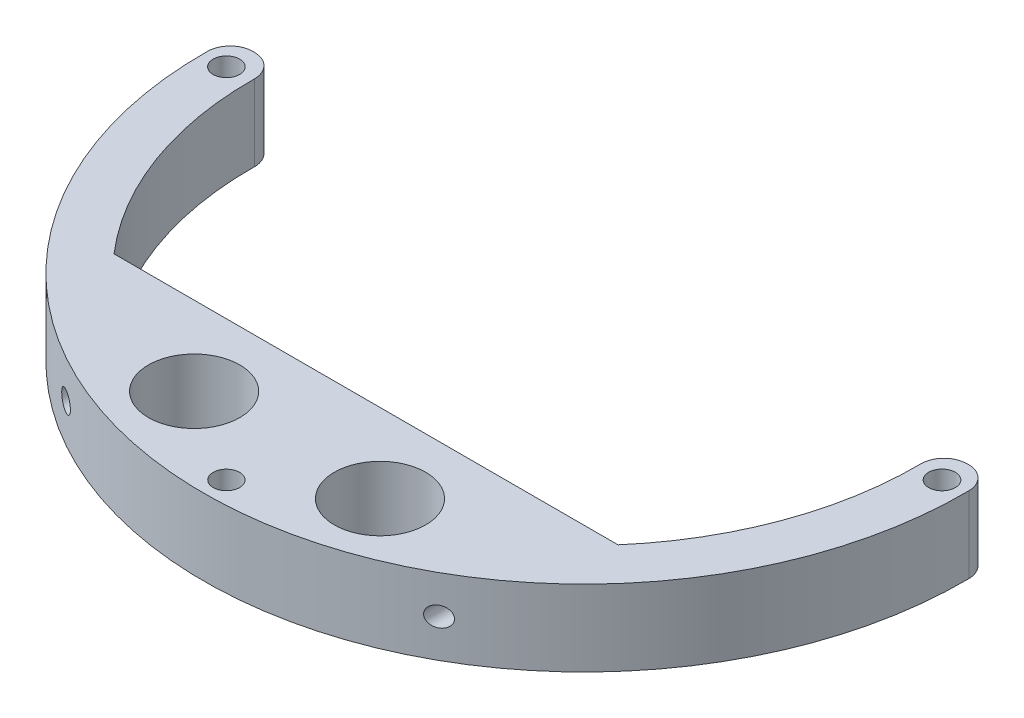
ISO-10303-21;
HEADER;
FILE_DESCRIPTION(('STEP AP214'),'2;1');
FILE_NAME('part.step','',(''),(''),'','','');
FILE_SCHEMA(('AUTOMOTIVE_DESIGN { 1 0 10303 214 1 1 1 1 }'));
ENDSEC;
DATA;
#1=APPLICATION_CONTEXT('core data for automotive mechanical design processes');
#2=APPLICATION_PROTOCOL_DEFINITION('international standard','automotive_design',2000,#1);
#3=PRODUCT_CONTEXT('',#1,'mechanical');
#4=PRODUCT('Part','Part','',(#3));
#5=PRODUCT_RELATED_PRODUCT_CATEGORY('part','',(#4));
#6=PRODUCT_DEFINITION_FORMATION('','',#4);
#7=PRODUCT_DEFINITION_CONTEXT('part definition',#1,'design');
#8=PRODUCT_DEFINITION('design','',#6,#7);
#9=PRODUCT_DEFINITION_SHAPE('','',#8);
#10=(LENGTH_UNIT() NAMED_UNIT(*) SI_UNIT(.MILLI.,.METRE.));
#11=(NAMED_UNIT(*) PLANE_ANGLE_UNIT() SI_UNIT($,.RADIAN.));
#12=(NAMED_UNIT(*) SI_UNIT($,.STERADIAN.) SOLID_ANGLE_UNIT());
#13=UNCERTAINTY_MEASURE_WITH_UNIT(LENGTH_MEASURE(1.E-05),#10,'distance_accuracy_value','');
#14=(GEOMETRIC_REPRESENTATION_CONTEXT(3) GLOBAL_UNCERTAINTY_ASSIGNED_CONTEXT((#13)) GLOBAL_UNIT_ASSIGNED_CONTEXT((#10,
#11,#12)) REPRESENTATION_CONTEXT('',''));
#15=CARTESIAN_POINT('',(0.,0.,0.));
#16=DIRECTION('',(0.,0.,1.));
#17=DIRECTION('',(1.,0.,0.));
#18=AXIS2_PLACEMENT_3D('',#15,#16,#17);
#19=CARTESIAN_POINT('',(0.,10.,0.));
#20=DIRECTION('',(0.,-1.,0.));
#21=DIRECTION('',(0.,0.,-1.));
#22=AXIS2_PLACEMENT_3D('',#19,#20,#21);
#23=PLANE('',#22);
#24=CARTESIAN_POINT('',(0.,10.,0.));
#25=DIRECTION('',(0.,1.,0.));
#26=DIRECTION('',(0.,0.,1.));
#27=AXIS2_PLACEMENT_3D('',#24,#25,#26);
#28=CIRCLE('',#27,49.9999999999988);
#29=CARTESIAN_POINT('',(-49.9972274086437,10.,-0.526546719910579));
#30=VERTEX_POINT('',#29);
#31=CARTESIAN_POINT('',(49.9972274086437,10.,-0.526546719910586));
#32=VERTEX_POINT('',#31);
#33=EDGE_CURVE('E233',#30,#32,#28,.T.);
#34=ORIENTED_EDGE('',*,*,#33,.T.);
#35=CARTESIAN_POINT('',(46.997393764125,10.,-0.49495391671595));
#36=DIRECTION('',(0.,-1.,0.));
#37=DIRECTION('',(0.,0.,-1.));
#38=AXIS2_PLACEMENT_3D('',#35,#36,#37);
#39=CIRCLE('',#38,3.);
#40=CARTESIAN_POINT('',(46.7440831125681,10.,-3.48424040579789));
#41=VERTEX_POINT('',#40);
#42=EDGE_CURVE('E203',#32,#41,#39,.F.);
#43=ORIENTED_EDGE('',*,*,#42,.T.);
#44=DIRECTION('',(-0.996428829693982,0.,0.0844368838522697));
#45=VECTOR('',#44,1.);
#46=CARTESIAN_POINT('',(49.859310291825,10.,-3.74822320885381));
#47=LINE('',#46,#45);
#48=CARTESIAN_POINT('',(46.5274746022037,10.,-3.46588510827336));
#49=VERTEX_POINT('',#48);
#50=EDGE_CURVE('E126',#41,#49,#47,.T.);
#51=ORIENTED_EDGE('',*,*,#50,.T.);
#52=CARTESIAN_POINT('',(46.7807852537605,10.,-0.476598619191415));
#53=DIRECTION('',(0.,-1.,0.));
#54=DIRECTION('',(0.,0.,-1.));
#55=AXIS2_PLACEMENT_3D('',#52,#53,#54);
#56=CIRCLE('',#55,3.);
#57=CARTESIAN_POINT('',(43.7809409320307,10.,-0.446036463088858));
#58=VERTEX_POINT('',#57);
#59=EDGE_CURVE('E54',#49,#58,#56,.F.);
#60=ORIENTED_EDGE('',*,*,#59,.T.);
#61=CARTESIAN_POINT('',(0.,10.,0.));
#62=DIRECTION('',(0.,-1.,0.));
#63=DIRECTION('',(0.,0.,1.));
#64=AXIS2_PLACEMENT_3D('',#61,#62,#63);
#65=CIRCLE('',#64,43.7832129636504);
#66=CARTESIAN_POINT('',(33.0995490719198,10.,28.6598951263946));
#67=VERTEX_POINT('',#66);
#68=EDGE_CURVE('E114',#58,#67,#65,.T.);
#69=ORIENTED_EDGE('',*,*,#68,.T.);
#70=DIRECTION('',(-1.,0.,0.));
#71=VECTOR('',#70,1.);
#72=CARTESIAN_POINT('',(-33.0995490719198,10.,28.6598951263946));
#73=LINE('',#72,#71);
#74=CARTESIAN_POINT('',(-33.0995490719198,10.,28.6598951263946));
#75=VERTEX_POINT('',#74);
#76=EDGE_CURVE('E120',#67,#75,#73,.T.);
#77=ORIENTED_EDGE('',*,*,#76,.T.);
#78=CARTESIAN_POINT('',(0.,10.,0.));
#79=DIRECTION('',(0.,-1.,0.));
#80=DIRECTION('',(0.,0.,-1.));
#81=AXIS2_PLACEMENT_3D('',#78,#79,#80);
#82=CIRCLE('',#81,43.7832129636504);
#83=CARTESIAN_POINT('',(-43.7809409320307,10.,-0.446036463088853));
#84=VERTEX_POINT('',#83);
#85=EDGE_CURVE('E168',#75,#84,#82,.T.);
#86=ORIENTED_EDGE('',*,*,#85,.T.);
#87=CARTESIAN_POINT('',(-46.7807852537605,10.,-0.476598619191409));
#88=DIRECTION('',(0.,-1.,0.));
#89=DIRECTION('',(0.,0.,-1.));
#90=AXIS2_PLACEMENT_3D('',#87,#88,#89);
#91=CIRCLE('',#90,3.);
#92=CARTESIAN_POINT('',(-46.5274746022037,10.,-3.46588510827335));
#93=VERTEX_POINT('',#92);
#94=EDGE_CURVE('E195',#84,#93,#91,.F.);
#95=ORIENTED_EDGE('',*,*,#94,.T.);
#96=DIRECTION('',(-0.996428829693982,0.,-0.0844368838522676));
#97=VECTOR('',#96,1.);
#98=CARTESIAN_POINT('',(-49.859310291825,10.,-3.7482232088538));
#99=LINE('',#98,#97);
#100=CARTESIAN_POINT('',(-46.7440831125681,10.,-3.48424040579789));
#101=VERTEX_POINT('',#100);
#102=EDGE_CURVE('E216',#93,#101,#99,.T.);
#103=ORIENTED_EDGE('',*,*,#102,.T.);
#104=CARTESIAN_POINT('',(-46.997393764125,10.,-0.494953916715943));
#105=DIRECTION('',(0.,-1.,0.));
#106=DIRECTION('',(0.,0.,-1.));
#107=AXIS2_PLACEMENT_3D('',#104,#105,#106);
#108=CIRCLE('',#107,3.);
#109=EDGE_CURVE('E198',#101,#30,#108,.F.);
#110=ORIENTED_EDGE('',*,*,#109,.T.);
#111=EDGE_LOOP('',(#34,#43,#51,#60,#69,#77,#86,#95,#103,#110));
#112=FACE_BOUND('',#111,.T.);
#113=CARTESIAN_POINT('',(-47.,10.,0.));
#114=DIRECTION('',(0.,1.,0.));
#115=DIRECTION('',(0.,0.,1.));
#116=AXIS2_PLACEMENT_3D('',#113,#114,#115);
#117=CIRCLE('',#116,1.75);
#118=CARTESIAN_POINT('',(-47.,10.,1.75));
#119=VERTEX_POINT('',#118);
#120=EDGE_CURVE('E153',#119,#119,#117,.T.);
#121=ORIENTED_EDGE('',*,*,#120,.F.);
#122=EDGE_LOOP('',(#121));
#123=FACE_BOUND('',#122,.T.);
#124=CARTESIAN_POINT('',(0.,10.,47.));
#125=DIRECTION('',(0.,1.,0.));
#126=DIRECTION('',(0.,0.,-1.));
#127=AXIS2_PLACEMENT_3D('',#124,#125,#126);
#128=CIRCLE('',#127,1.7353023937338);
#129=CARTESIAN_POINT('',(0.,10.,45.2646976062662));
#130=VERTEX_POINT('',#129);
#131=EDGE_CURVE('E247',#130,#130,#128,.T.);
#132=ORIENTED_EDGE('',*,*,#131,.F.);
#133=EDGE_LOOP('',(#132));
#134=FACE_BOUND('',#133,.T.);
#135=CARTESIAN_POINT('',(12.2081171528877,10.,39.0309929674964));
#136=DIRECTION('',(0.,1.,0.));
#137=DIRECTION('',(0.,0.,-1.));
#138=AXIS2_PLACEMENT_3D('',#135,#136,#137);
#139=CIRCLE('',#138,6.);
#140=CARTESIAN_POINT('',(12.2081171528877,10.,33.0309929674964));
#141=VERTEX_POINT('',#140);
#142=EDGE_CURVE('E255',#141,#141,#139,.T.);
#143=ORIENTED_EDGE('',*,*,#142,.F.);
#144=EDGE_LOOP('',(#143));
#145=FACE_BOUND('',#144,.T.);
#146=CARTESIAN_POINT('',(-12.2081171528872,10.,39.030992967497));
#147=DIRECTION('',(0.,1.,0.));
#148=DIRECTION('',(0.,0.,1.));
#149=AXIS2_PLACEMENT_3D('',#146,#147,#148);
#150=CIRCLE('',#149,6.);
#151=CARTESIAN_POINT('',(-12.2081171528872,10.,45.030992967497));
#152=VERTEX_POINT('',#151);
#153=EDGE_CURVE('E263',#152,#152,#150,.T.);
#154=ORIENTED_EDGE('',*,*,#153,.F.);
#155=EDGE_LOOP('',(#154));
#156=FACE_BOUND('',#155,.T.);
#157=CARTESIAN_POINT('',(47.,10.,0.));
#158=DIRECTION('',(0.,1.,0.));
#159=DIRECTION('',(0.,0.,-1.));
#160=AXIS2_PLACEMENT_3D('',#157,#158,#159);
#161=CIRCLE('',#160,1.750000000002);
#162=CARTESIAN_POINT('',(47.,10.,-1.75000000000202));
#163=VERTEX_POINT('',#162);
#164=EDGE_CURVE('E271',#163,#163,#161,.T.);
#165=ORIENTED_EDGE('',*,*,#164,.F.);
#166=EDGE_LOOP('',(#165));
#167=FACE_BOUND('',#166,.T.);
#168=ADVANCED_FACE('F38',(#112,#123,#134,#145,#156,#167),#23,.F.);
#169=CARTESIAN_POINT('',(0.,0.,0.));
#170=DIRECTION('',(0.,-1.,0.));
#171=DIRECTION('',(0.,0.,-1.));
#172=AXIS2_PLACEMENT_3D('',#169,#170,#171);
#173=PLANE('',#172);
#174=CARTESIAN_POINT('',(-12.2081171528872,0.,39.030992967497));
#175=DIRECTION('',(0.,1.,0.));
#176=DIRECTION('',(0.,0.,1.));
#177=AXIS2_PLACEMENT_3D('',#174,#175,#176);
#178=CIRCLE('',#177,6.);
#179=CARTESIAN_POINT('',(-12.2081171528872,0.,45.030992967497));
#180=VERTEX_POINT('',#179);
#181=EDGE_CURVE('E267',#180,#180,#178,.T.);
#182=ORIENTED_EDGE('',*,*,#181,.T.);
#183=EDGE_LOOP('',(#182));
#184=FACE_BOUND('',#183,.T.);
#185=CARTESIAN_POINT('',(0.,0.,47.));
#186=DIRECTION('',(0.,1.,0.));
#187=DIRECTION('',(0.,0.,-1.));
#188=AXIS2_PLACEMENT_3D('',#185,#186,#187);
#189=CIRCLE('',#188,1.7353023937338);
#190=CARTESIAN_POINT('',(0.,0.,45.2646976062662));
#191=VERTEX_POINT('',#190);
#192=EDGE_CURVE('E251',#191,#191,#189,.T.);
#193=ORIENTED_EDGE('',*,*,#192,.T.);
#194=EDGE_LOOP('',(#193));
#195=FACE_BOUND('',#194,.T.);
#196=DIRECTION('',(-0.996428829693982,0.,0.0844368838522697));
#197=VECTOR('',#196,1.);
#198=CARTESIAN_POINT('',(49.859310291825,0.,-3.74822320885381));
#199=LINE('',#198,#197);
#200=CARTESIAN_POINT('',(46.7440831125681,0.,-3.48424040579789));
#201=VERTEX_POINT('',#200);
#202=CARTESIAN_POINT('',(46.5274746022037,0.,-3.46588510827336));
#203=VERTEX_POINT('',#202);
#204=EDGE_CURVE('E160',#201,#203,#199,.T.);
#205=ORIENTED_EDGE('',*,*,#204,.F.);
#206=CARTESIAN_POINT('',(46.997393764125,0.,-0.49495391671595));
#207=DIRECTION('',(0.,-1.,0.));
#208=DIRECTION('',(0.,0.,-1.));
#209=AXIS2_PLACEMENT_3D('',#206,#207,#208);
#210=CIRCLE('',#209,3.);
#211=CARTESIAN_POINT('',(49.9972274086437,0.,-0.526546719910586));
#212=VERTEX_POINT('',#211);
#213=EDGE_CURVE('E185',#201,#212,#210,.T.);
#214=ORIENTED_EDGE('',*,*,#213,.T.);
#215=CARTESIAN_POINT('',(0.,0.,0.));
#216=DIRECTION('',(0.,1.,0.));
#217=DIRECTION('',(0.,0.,1.));
#218=AXIS2_PLACEMENT_3D('',#215,#216,#217);
#219=CIRCLE('',#218,49.9999999999988);
#220=CARTESIAN_POINT('',(-49.9972274086437,0.,-0.526546719910579));
#221=VERTEX_POINT('',#220);
#222=EDGE_CURVE('E156',#221,#212,#219,.T.);
#223=ORIENTED_EDGE('',*,*,#222,.F.);
#224=CARTESIAN_POINT('',(-46.997393764125,0.,-0.494953916715943));
#225=DIRECTION('',(0.,-1.,0.));
#226=DIRECTION('',(0.,0.,-1.));
#227=AXIS2_PLACEMENT_3D('',#224,#225,#226);
#228=CIRCLE('',#227,3.);
#229=CARTESIAN_POINT('',(-46.7440831125681,0.,-3.48424040579789));
#230=VERTEX_POINT('',#229);
#231=EDGE_CURVE('E179',#221,#230,#228,.T.);
#232=ORIENTED_EDGE('',*,*,#231,.T.);
#233=DIRECTION('',(-0.996428829693982,0.,-0.0844368838522676));
#234=VECTOR('',#233,1.);
#235=CARTESIAN_POINT('',(-49.859310291825,0.,-3.7482232088538));
#236=LINE('',#235,#234);
#237=CARTESIAN_POINT('',(-46.5274746022037,0.,-3.46588510827335));
#238=VERTEX_POINT('',#237);
#239=EDGE_CURVE('E152',#238,#230,#236,.T.);
#240=ORIENTED_EDGE('',*,*,#239,.F.);
#241=CARTESIAN_POINT('',(-46.7807852537605,0.,-0.476598619191409));
#242=DIRECTION('',(0.,-1.,0.));
#243=DIRECTION('',(0.,0.,-1.));
#244=AXIS2_PLACEMENT_3D('',#241,#242,#243);
#245=CIRCLE('',#244,3.);
#246=CARTESIAN_POINT('',(-43.7809409320307,0.,-0.446036463088853));
#247=VERTEX_POINT('',#246);
#248=EDGE_CURVE('E176',#238,#247,#245,.T.);
#249=ORIENTED_EDGE('',*,*,#248,.T.);
#250=CARTESIAN_POINT('',(0.,0.,0.));
#251=DIRECTION('',(0.,-1.,0.));
#252=DIRECTION('',(0.,0.,-1.));
#253=AXIS2_PLACEMENT_3D('',#250,#251,#252);
#254=CIRCLE('',#253,43.7832129636504);
#255=CARTESIAN_POINT('',(-33.0995490719198,0.,28.6598951263946));
#256=VERTEX_POINT('',#255);
#257=EDGE_CURVE('E148',#256,#247,#254,.T.);
#258=ORIENTED_EDGE('',*,*,#257,.F.);
#259=DIRECTION('',(-1.,0.,0.));
#260=VECTOR('',#259,1.);
#261=CARTESIAN_POINT('',(-33.0995490719198,0.,28.6598951263946));
#262=LINE('',#261,#260);
#263=CARTESIAN_POINT('',(33.0995490719198,0.,28.6598951263946));
#264=VERTEX_POINT('',#263);
#265=EDGE_CURVE('E166',#264,#256,#262,.T.);
#266=ORIENTED_EDGE('',*,*,#265,.F.);
#267=CARTESIAN_POINT('',(0.,0.,0.));
#268=DIRECTION('',(0.,-1.,0.));
#269=DIRECTION('',(0.,0.,1.));
#270=AXIS2_PLACEMENT_3D('',#267,#268,#269);
#271=CIRCLE('',#270,43.7832129636504);
#272=CARTESIAN_POINT('',(43.7809409320307,0.,-0.446036463088858));
#273=VERTEX_POINT('',#272);
#274=EDGE_CURVE('E132',#273,#264,#271,.T.);
#275=ORIENTED_EDGE('',*,*,#274,.F.);
#276=CARTESIAN_POINT('',(46.7807852537605,0.,-0.476598619191415));
#277=DIRECTION('',(0.,-1.,0.));
#278=DIRECTION('',(0.,0.,-1.));
#279=AXIS2_PLACEMENT_3D('',#276,#277,#278);
#280=CIRCLE('',#279,3.);
#281=EDGE_CURVE('E182',#273,#203,#280,.T.);
#282=ORIENTED_EDGE('',*,*,#281,.T.);
#283=EDGE_LOOP('',(#205,#214,#223,#232,#240,#249,#258,#266,#275,#282));
#284=FACE_BOUND('',#283,.T.);
#285=CARTESIAN_POINT('',(-47.,0.,0.));
#286=DIRECTION('',(0.,1.,0.));
#287=DIRECTION('',(0.,0.,1.));
#288=AXIS2_PLACEMENT_3D('',#285,#286,#287);
#289=CIRCLE('',#288,1.75);
#290=CARTESIAN_POINT('',(-47.,0.,1.75));
#291=VERTEX_POINT('',#290);
#292=EDGE_CURVE('E243',#291,#291,#289,.T.);
#293=ORIENTED_EDGE('',*,*,#292,.T.);
#294=EDGE_LOOP('',(#293));
#295=FACE_BOUND('',#294,.T.);
#296=CARTESIAN_POINT('',(12.2081171528877,0.,39.0309929674964));
#297=DIRECTION('',(0.,1.,0.));
#298=DIRECTION('',(0.,0.,-1.));
#299=AXIS2_PLACEMENT_3D('',#296,#297,#298);
#300=CIRCLE('',#299,6.);
#301=CARTESIAN_POINT('',(12.2081171528877,0.,33.0309929674964));
#302=VERTEX_POINT('',#301);
#303=EDGE_CURVE('E259',#302,#302,#300,.T.);
#304=ORIENTED_EDGE('',*,*,#303,.T.);
#305=EDGE_LOOP('',(#304));
#306=FACE_BOUND('',#305,.T.);
#307=CARTESIAN_POINT('',(47.,0.,0.));
#308=DIRECTION('',(0.,1.,0.));
#309=DIRECTION('',(0.,0.,-1.));
#310=AXIS2_PLACEMENT_3D('',#307,#308,#309);
#311=CIRCLE('',#310,1.750000000002);
#312=CARTESIAN_POINT('',(47.,0.,-1.75000000000202));
#313=VERTEX_POINT('',#312);
#314=EDGE_CURVE('E275',#313,#313,#311,.T.);
#315=ORIENTED_EDGE('',*,*,#314,.T.);
#316=EDGE_LOOP('',(#315));
#317=FACE_BOUND('',#316,.T.);
#318=ADVANCED_FACE('F221',(#184,#195,#284,#295,#306,#317),#173,.T.);
#319=CARTESIAN_POINT('',(0.,10.,0.));
#320=DIRECTION('',(0.,-1.,0.));
#321=DIRECTION('',(0.,0.,-1.));
#322=AXIS2_PLACEMENT_3D('',#319,#320,#321);
#323=CYLINDRICAL_SURFACE('',#322,43.7832129636504);
#324=ORIENTED_EDGE('',*,*,#257,.T.);
#325=DIRECTION('',(0.,-1.,0.));
#326=VECTOR('',#325,1.);
#327=CARTESIAN_POINT('',(-43.7809409320307,10.,-0.446036463088853));
#328=LINE('',#327,#326);
#329=EDGE_CURVE('E11',#247,#84,#328,.F.);
#330=ORIENTED_EDGE('',*,*,#329,.T.);
#331=ORIENTED_EDGE('',*,*,#85,.F.);
#332=DIRECTION('',(0.,-1.,0.));
#333=VECTOR('',#332,1.);
#334=CARTESIAN_POINT('',(-33.0995490719198,10.,28.6598951263946));
#335=LINE('',#334,#333);
#336=EDGE_CURVE('E137',#75,#256,#335,.T.);
#337=ORIENTED_EDGE('',*,*,#336,.T.);
#338=EDGE_LOOP('',(#324,#330,#331,#337));
#339=FACE_BOUND('',#338,.T.);
#340=ADVANCED_FACE('F334',(#339),#323,.F.);
#341=CARTESIAN_POINT('',(-49.859310291825,10.,-3.7482232088538));
#342=DIRECTION('',(-0.0844368838522676,0.,0.996428829693982));
#343=DIRECTION('',(0.996428829693982,0.,0.0844368838522676));
#344=AXIS2_PLACEMENT_3D('',#341,#342,#343);
#345=PLANE('',#344);
#346=ORIENTED_EDGE('',*,*,#239,.T.);
#347=DIRECTION('',(0.,-1.,0.));
#348=VECTOR('',#347,1.);
#349=CARTESIAN_POINT('',(-46.7440831125681,10.,-3.48424040579789));
#350=LINE('',#349,#348);
#351=EDGE_CURVE('E47',#230,#101,#350,.F.);
#352=ORIENTED_EDGE('',*,*,#351,.T.);
#353=ORIENTED_EDGE('',*,*,#102,.F.);
#354=DIRECTION('',(0.,-1.,0.));
#355=VECTOR('',#354,1.);
#356=CARTESIAN_POINT('',(-46.5274746022037,10.,-3.46588510827335));
#357=LINE('',#356,#355);
#358=EDGE_CURVE('E209',#93,#238,#357,.T.);
#359=ORIENTED_EDGE('',*,*,#358,.T.);
#360=EDGE_LOOP('',(#346,#352,#353,#359));
#361=FACE_BOUND('',#360,.T.);
#362=ADVANCED_FACE('F215',(#361),#345,.F.);
#363=CARTESIAN_POINT('',(0.,10.,0.));
#364=DIRECTION('',(0.,-1.,0.));
#365=DIRECTION('',(0.,0.,-1.));
#366=AXIS2_PLACEMENT_3D('',#363,#364,#365);
#367=CYLINDRICAL_SURFACE('',#366,49.9999999999988);
#368=CARTESIAN_POINT('',(-25.7999934874738,5.02526316537584,42.8294330577255));
#369=CARTESIAN_POINT('',(-25.7999893380254,5.09076688627117,42.8294357089718));
#370=CARTESIAN_POINT('',(-25.7950118462503,5.15633897311552,42.8324351679322));
#371=CARTESIAN_POINT('',(-25.7753547714024,5.28552932204338,42.8442669573359));
#372=CARTESIAN_POINT('',(-25.7606591447959,5.34914417089712,42.85310893309));
#373=CARTESIAN_POINT('',(-25.7223921638513,5.47235010631283,42.876089290113));
#374=CARTESIAN_POINT('',(-25.698853699102,5.53195514986238,42.8902080442196));
#375=CARTESIAN_POINT('',(-25.6439603924868,5.646028985418,42.9230510778811));
#376=CARTESIAN_POINT('',(-25.6126060679422,5.70049811703454,42.9417750526214));
#377=CARTESIAN_POINT('',(-25.5412633748741,5.80632588590958,42.9842492109798));
#378=CARTESIAN_POINT('',(-25.5008837974589,5.85732852201816,43.0082255906994));
#379=CARTESIAN_POINT('',(-25.4140524555835,5.95188176744041,43.0595922412296));
#380=CARTESIAN_POINT('',(-25.3675980842668,5.99542915887716,43.0869839774248));
#381=CARTESIAN_POINT('',(-25.2631877868906,6.08008316717226,43.1482963865113));
#382=CARTESIAN_POINT('',(-25.2045274748107,6.1200449080782,43.1825978680917));
#383=CARTESIAN_POINT('',(-25.0826104780436,6.18951713880106,43.2535274298388));
#384=CARTESIAN_POINT('',(-25.0193512475708,6.21902178605812,43.2901567972008));
#385=CARTESIAN_POINT('',(-24.8812369707137,6.27056128964972,43.3697034997026));
#386=CARTESIAN_POINT('',(-24.8059442983703,6.29112411074977,43.4128187348702));
#387=CARTESIAN_POINT('',(-24.653256531982,6.31852758613374,43.4997088617462));
#388=CARTESIAN_POINT('',(-24.57586048014,6.32536187915648,43.5434840497904));
#389=CARTESIAN_POINT('',(-24.4150772577193,6.3251549584865,43.6338528040294));
#390=CARTESIAN_POINT('',(-24.3316708994811,6.3170486224389,43.6804149933069));
#391=CARTESIAN_POINT('',(-24.1669862618882,6.28468691530931,43.7717448058892));
#392=CARTESIAN_POINT('',(-24.0857083194895,6.26042900309504,43.8165121456346));
#393=CARTESIAN_POINT('',(-23.9292284643574,6.1962723002094,43.9021623064696));
#394=CARTESIAN_POINT('',(-23.8539503052521,6.15662920471361,43.9430957044735));
#395=CARTESIAN_POINT('',(-23.7110168074873,6.06201105554023,44.0203848062878));
#396=CARTESIAN_POINT('',(-23.6433567821552,6.00704550138696,44.0567433261975));
#397=CARTESIAN_POINT('',(-23.5251305020064,5.88893025254006,44.1199761170397));
#398=CARTESIAN_POINT('',(-23.4735358156326,5.82712582844948,44.1474325365071));
#399=CARTESIAN_POINT('',(-23.3818551932939,5.69333525780574,44.196058074893));
#400=CARTESIAN_POINT('',(-23.3417565963046,5.62136044372685,44.2172341114988));
#401=CARTESIAN_POINT('',(-23.2798033833195,5.47949857823006,44.249879362681));
#402=CARTESIAN_POINT('',(-23.2562540687494,5.41055786965727,44.2622529369388));
#403=CARTESIAN_POINT('',(-23.2209544988601,5.26892722297918,44.2807822708067));
#404=CARTESIAN_POINT('',(-23.2091957836066,5.19624001247578,44.2869424886132));
#405=CARTESIAN_POINT('',(-23.1986713054985,5.05667722482253,44.292456208518));
#406=CARTESIAN_POINT('',(-23.198774746683,4.98990747333265,44.2924021083751));
#407=CARTESIAN_POINT('',(-23.2091665679811,4.85739657461975,44.2869576937641));
#408=CARTESIAN_POINT('',(-23.2194528936705,4.79165522263206,44.2815684556743));
#409=CARTESIAN_POINT('',(-23.2493672207346,4.66456779135892,44.2658694382703));
#410=CARTESIAN_POINT('',(-23.2687776765783,4.60315578808121,44.2556742318165));
#411=CARTESIAN_POINT('',(-23.3160169684815,4.48464212288271,44.2308044408234));
#412=CARTESIAN_POINT('',(-23.3438470076815,4.42754107844689,44.2161292160963));
#413=CARTESIAN_POINT('',(-23.4083952883666,4.31621322128371,44.1819920465078));
#414=CARTESIAN_POINT('',(-23.4454787314269,4.2622595636725,44.1623326899729));
#415=CARTESIAN_POINT('',(-23.5263961837438,4.16137971623955,44.1192790247764));
#416=CARTESIAN_POINT('',(-23.5702325533256,4.11445599492057,44.0958834100892));
#417=CARTESIAN_POINT('',(-23.6679030340333,4.0240247386043,44.0435434754368));
#418=CARTESIAN_POINT('',(-23.7222964234368,3.98130722607795,44.0142797275907));
#419=CARTESIAN_POINT('',(-23.8359512690684,3.90556759700377,43.9528338798385));
#420=CARTESIAN_POINT('',(-23.8952149135154,3.87254986941253,43.9206504674367));
#421=CARTESIAN_POINT('',(-24.0243437497033,3.81307953347361,43.8501645147238));
#422=CARTESIAN_POINT('',(-24.0946327248179,3.78786980798069,43.8115889189382));
#423=CARTESIAN_POINT('',(-24.2375477402811,3.74988226487058,43.7326874873431));
#424=CARTESIAN_POINT('',(-24.3101748906185,3.73711044448395,43.6923608169907));
#425=CARTESIAN_POINT('',(-24.4634682956506,3.72327633573388,43.6067331019206));
#426=CARTESIAN_POINT('',(-24.544204742498,3.72352890592662,43.5613414424675));
#427=CARTESIAN_POINT('',(-24.7043670413865,3.73890824627399,43.4707111430899));
#428=CARTESIAN_POINT('',(-24.7837923483113,3.75404105214154,43.4254725727331));
#429=CARTESIAN_POINT('',(-24.9423336936206,3.79994118337128,43.3346127262005));
#430=CARTESIAN_POINT('',(-25.0213103907263,3.83130943895761,43.2890484701012));
#431=CARTESIAN_POINT('',(-25.1730068326495,3.90976343734359,43.201011759261));
#432=CARTESIAN_POINT('',(-25.245726898068,3.95684837418795,43.1585391461159));
#433=CARTESIAN_POINT('',(-25.3781864058744,4.06318873122481,43.0807756685537));
#434=CARTESIAN_POINT('',(-25.4384217620757,4.12162547731625,43.0452173021624));
#435=CARTESIAN_POINT('',(-25.5477823318029,4.25112208440035,42.9804009291829));
#436=CARTESIAN_POINT('',(-25.5969173474669,4.32217070869038,42.9511373650808));
#437=CARTESIAN_POINT('',(-25.6751397900651,4.46429909788253,42.9044168997723));
#438=CARTESIAN_POINT('',(-25.7060593914235,4.53401746543506,42.8858872070955));
#439=CARTESIAN_POINT('',(-25.7553856032479,4.67911728935262,42.856282577099));
#440=CARTESIAN_POINT('',(-25.773831778517,4.75447998935087,42.8451840697089));
#441=CARTESIAN_POINT('',(-25.7902590197372,4.86317043332086,42.835295766634));
#442=CARTESIAN_POINT('',(-25.7939026119482,4.89543513535774,42.8331016346402));
#443=CARTESIAN_POINT('',(-25.7987708837705,4.96021532462798,42.8301696172746));
#444=CARTESIAN_POINT('',(-25.7999955482928,4.99273081342445,42.8294317409868));
#445=CARTESIAN_POINT('',(-25.7999934874738,5.02526316537584,42.8294330577255));
#446=B_SPLINE_CURVE_WITH_KNOTS('',3,(#368,#369,#370,#371,#372,#373,#374,#375,#376,#377,#378,
#379,#380,#381,#382,#383,#384,#385,#386,#387,#388,#389,#390,#391,#392,#393,#394,#395,#396,#397,
#398,#399,#400,#401,#402,#403,#404,#405,#406,#407,#408,#409,#410,#411,#412,#413,#414,#415,#416,
#417,#418,#419,#420,#421,#422,#423,#424,#425,#426,#427,#428,#429,#430,#431,#432,#433,#434,#435,
#436,#437,#438,#439,#440,#441,#442,#443,#444,#445),.UNSPECIFIED.,.T.,.F.,(4,2,2,2,2,2,2,2,2,2,2,
2,2,2,2,2,2,2,2,2,2,2,2,2,2,2,2,2,2,2,2,2,2,2,2,2,2,2,4),(0.,0.196379172232976,
0.393083356176662,0.58906305791891,0.785029791466927,0.99220302331417,1.19946545227697,
1.43502389380698,1.67071373922263,1.93707958352731,2.20356882286796,2.4897945600332,
2.77606533982274,3.05776919571047,3.33929878950248,3.59301127041075,3.84644324642633,
4.06690807327927,4.28721459982653,4.48653900055042,4.68582319523593,4.88057979778099,
5.07536424378576,5.27958273963281,5.48387277784752,5.70825733254752,5.932743260894,
6.18385062685862,6.43507901032838,6.7117150454692,6.98846333587102,7.27627699024038,
7.5640758877216,7.83593208160242,8.10754726670357,8.34162359008862,8.57495391317178,
8.67248480772852,8.77001631066736),.UNSPECIFIED.);
#447=CARTESIAN_POINT('',(-25.7999934874738,5.02526316537584,42.8294330577255));
#448=VERTEX_POINT('',#447);
#449=EDGE_CURVE('E279',#448,#448,#446,.T.);
#450=ORIENTED_EDGE('',*,*,#449,.T.);
#451=EDGE_LOOP('',(#450));
#452=FACE_BOUND('',#451,.T.);
#453=CARTESIAN_POINT('',(23.2,5.,44.2917599559994));
#454=CARTESIAN_POINT('',(23.2000030489971,5.06685354656852,44.2917584818056));
#455=CARTESIAN_POINT('',(23.2051829712927,5.13374378191699,44.289046308623));
#456=CARTESIAN_POINT('',(23.2256607822069,5.26555084000743,44.2783108181499));
#457=CARTESIAN_POINT('',(23.2409680305821,5.33046577905793,44.2702825877103));
#458=CARTESIAN_POINT('',(23.280927912492,5.45629995017281,44.2492813396422));
#459=CARTESIAN_POINT('',(23.3055562009771,5.51722911034593,44.2363212028759));
#460=CARTESIAN_POINT('',(23.3631068302247,5.63379996747237,44.2059531396604));
#461=CARTESIAN_POINT('',(23.3960292452366,5.6894416170854,44.1885451733938));
#462=CARTESIAN_POINT('',(23.470526983978,5.79663555296811,44.1490227687062));
#463=CARTESIAN_POINT('',(23.5124155706778,5.84790595937503,44.1267370027643));
#464=CARTESIAN_POINT('',(23.6024484152433,5.94269790851489,44.0786460052433));
#465=CARTESIAN_POINT('',(23.6505948572505,5.98621673313015,44.0528395447007));
#466=CARTESIAN_POINT('',(23.7572383006169,6.06927653163329,43.9954278548077));
#467=CARTESIAN_POINT('',(23.8162915700959,6.10787752887436,43.9634973196952));
#468=CARTESIAN_POINT('',(23.938651475574,6.17462837171638,43.8969910394702));
#469=CARTESIAN_POINT('',(24.0019601703735,6.20277311491042,43.8624140128308));
#470=CARTESIAN_POINT('',(24.1389139439953,6.25119662981955,43.7872084175698));
#471=CARTESIAN_POINT('',(24.2128979348615,6.27015763078781,43.746346883807));
#472=CARTESIAN_POINT('',(24.3623195684454,6.29490763844501,43.6633107320208));
#473=CARTESIAN_POINT('',(24.4377578320155,6.30069088786571,43.6211355482263));
#474=CARTESIAN_POINT('',(24.5949982121736,6.29911123973436,43.5326876091452));
#475=CARTESIAN_POINT('',(24.676772486661,6.29053922364764,43.4863826377631));
#476=CARTESIAN_POINT('',(24.8377753244537,6.25803695790606,43.3946253851014));
#477=CARTESIAN_POINT('',(24.9170024670461,6.23409828807251,43.3491735853807));
#478=CARTESIAN_POINT('',(25.0718279199448,6.17052565732379,43.2598146234599));
#479=CARTESIAN_POINT('',(25.1473464002001,6.13064311206303,43.2159445348068));
#480=CARTESIAN_POINT('',(25.2905748639535,6.03554766484642,43.1322812638752));
#481=CARTESIAN_POINT('',(25.3582947396926,5.98035449384132,43.0924829240512));
#482=CARTESIAN_POINT('',(25.4687026340874,5.86963894682242,43.0272975713647));
#483=CARTESIAN_POINT('',(25.5135873056335,5.81701763738015,43.0006874199937));
#484=CARTESIAN_POINT('',(25.5951982777618,5.70384506934161,42.9521603291831));
#485=CARTESIAN_POINT('',(25.6319289986,5.64329813566522,42.9302408471652));
#486=CARTESIAN_POINT('',(25.6957393229819,5.51513198585823,42.8920783060998));
#487=CARTESIAN_POINT('',(25.722758962894,5.44747205423954,42.8758705270459));
#488=CARTESIAN_POINT('',(25.7652515056777,5.30738152361488,42.8503493713941));
#489=CARTESIAN_POINT('',(25.7807320340156,5.23495410964193,42.8410314417648));
#490=CARTESIAN_POINT('',(25.798116416388,5.09611433819715,42.8305647543754));
#491=CARTESIAN_POINT('',(25.8013331169994,5.02992329472241,42.8286260875687));
#492=CARTESIAN_POINT('',(25.7976658906057,4.89793683345646,42.8308351613182));
#493=CARTESIAN_POINT('',(25.7907851944859,4.8321412958775,42.8349809550169));
#494=CARTESIAN_POINT('',(25.7678868519757,4.70611527816402,42.8487592639325));
#495=CARTESIAN_POINT('',(25.7523280107464,4.6457696169738,42.8581162347713));
#496=CARTESIAN_POINT('',(25.7131526607298,4.52875775529138,42.8816312529612));
#497=CARTESIAN_POINT('',(25.6895350381565,4.47209206468886,42.8957899639483));
#498=CARTESIAN_POINT('',(25.6337703437374,4.36074800076796,42.9291383897576));
#499=CARTESIAN_POINT('',(25.601240979615,4.30632961185318,42.9485529684471));
#500=CARTESIAN_POINT('',(25.5295268964293,4.20376157809867,42.9912199914904));
#501=CARTESIAN_POINT('',(25.4903394705137,4.15561449699617,43.0144739966641));
#502=CARTESIAN_POINT('',(25.4014642226377,4.06081256754116,43.0670243011038));
#503=CARTESIAN_POINT('',(25.3510808987686,4.01502719252622,43.0967107137588));
#504=CARTESIAN_POINT('',(25.2449727418308,3.93250775726323,43.1589520336947));
#505=CARTESIAN_POINT('',(25.1892451586942,3.89577839217947,43.1915084171118));
#506=CARTESIAN_POINT('',(25.0657687671018,3.82715692820929,43.2632986098039));
#507=CARTESIAN_POINT('',(24.9974254274173,3.79664558331889,43.3028317601326));
#508=CARTESIAN_POINT('',(24.8573344070823,3.7478736834432,43.3834008368342));
#509=CARTESIAN_POINT('',(24.7855849696458,3.72961952557576,43.4244375361572));
#510=CARTESIAN_POINT('',(24.6326578245029,3.70422920048563,43.5113856513547));
#511=CARTESIAN_POINT('',(24.5512824995154,3.69846514779868,43.557355611337));
#512=CARTESIAN_POINT('',(24.3885167777883,3.70223189277303,43.6486994920892));
#513=CARTESIAN_POINT('',(24.307126385475,3.71176794562971,43.6940732026655));
#514=CARTESIAN_POINT('',(24.1444622572204,3.74672666574638,43.7841730278844));
#515=CARTESIAN_POINT('',(24.063249218825,3.7725651900272,43.8288498077899));
#516=CARTESIAN_POINT('',(23.9059523986906,3.84050064700904,43.914843391091));
#517=CARTESIAN_POINT('',(23.8298673579624,3.88259357184209,43.9561610197189));
#518=CARTESIAN_POINT('',(23.6907055845464,3.97933992643604,44.0313106682448));
#519=CARTESIAN_POINT('',(23.627102964842,4.0329884651311,44.0654559144253));
#520=CARTESIAN_POINT('',(23.5100586960701,4.1532217585648,44.1280131779347));
#521=CARTESIAN_POINT('',(23.4566089900456,4.21979617027228,44.1564297424294));
#522=CARTESIAN_POINT('',(23.3687400218688,4.35507080608421,44.2029881423383));
#523=CARTESIAN_POINT('',(23.3327830881552,4.42248462243604,44.2219669653133));
#524=CARTESIAN_POINT('',(23.2729749467522,4.56380658171633,44.2534721017028));
#525=CARTESIAN_POINT('',(23.249098497377,4.63770080160511,44.2660118700863));
#526=CARTESIAN_POINT('',(23.2213954637208,4.76024590708946,44.2805479515497));
#527=CARTESIAN_POINT('',(23.2133928968154,4.80773796813796,44.2847425872791));
#528=CARTESIAN_POINT('',(23.2026943436366,4.90348036432823,44.2903489751795));
#529=CARTESIAN_POINT('',(23.199997798573,4.95173061908323,44.2917610203921));
#530=CARTESIAN_POINT('',(23.2,5.,44.2917599559994));
#531=B_SPLINE_CURVE_WITH_KNOTS('',3,(#453,#454,#455,#456,#457,#458,#459,#460,#461,#462,#463,
#464,#465,#466,#467,#468,#469,#470,#471,#472,#473,#474,#475,#476,#477,#478,#479,#480,#481,#482,
#483,#484,#485,#486,#487,#488,#489,#490,#491,#492,#493,#494,#495,#496,#497,#498,#499,#500,#501,
#502,#503,#504,#505,#506,#507,#508,#509,#510,#511,#512,#513,#514,#515,#516,#517,#518,#519,#520,
#521,#522,#523,#524,#525,#526,#527,#528,#529,#530),.UNSPECIFIED.,.T.,.F.,(4,2,2,2,2,2,2,2,2,2,2,
2,2,2,2,2,2,2,2,2,2,2,2,2,2,2,2,2,2,2,2,2,2,2,2,2,2,2,4),(0.,0.200374237618607,
0.400933921905226,0.600973351805115,0.801014572534812,1.00972854343044,1.21851555710525,
1.44989469528113,1.68138659321313,1.94015780435559,2.19904204918605,2.48084465071136,
2.76280179831669,3.04933804993888,3.33550674140881,3.55691509715283,3.77820313274102,
4.00083500056733,4.22331961437231,4.42118362693387,4.61898434233239,4.80720225553325,
4.99544619244991,5.19356025191061,5.39175504873435,5.6136889422603,5.83573765845907,
6.0886323421733,6.34165891114454,6.62131203508691,6.90106123329728,7.18825213138826,
7.47537226162807,7.74366078971923,8.01173551680522,8.24658107910921,8.4809338933699,
8.62562268903778,8.77029624635768),.UNSPECIFIED.);
#532=CARTESIAN_POINT('',(23.2,5.,44.2917599559994));
#533=VERTEX_POINT('',#532);
#534=EDGE_CURVE('E291',#533,#533,#531,.T.);
#535=ORIENTED_EDGE('',*,*,#534,.T.);
#536=EDGE_LOOP('',(#535));
#537=FACE_BOUND('',#536,.T.);
#538=ORIENTED_EDGE('',*,*,#222,.T.);
#539=DIRECTION('',(0.,-1.,0.));
#540=VECTOR('',#539,1.);
#541=CARTESIAN_POINT('',(49.9972274086437,10.,-0.526546719910586));
#542=LINE('',#541,#540);
#543=EDGE_CURVE('E192',#212,#32,#542,.F.);
#544=ORIENTED_EDGE('',*,*,#543,.T.);
#545=ORIENTED_EDGE('',*,*,#33,.F.);
#546=DIRECTION('',(0.,-1.,0.));
#547=VECTOR('',#546,1.);
#548=CARTESIAN_POINT('',(-49.9972274086437,10.,-0.526546719910579));
#549=LINE('',#548,#547);
#550=EDGE_CURVE('E188',#30,#221,#549,.T.);
#551=ORIENTED_EDGE('',*,*,#550,.T.);
#552=EDGE_LOOP('',(#538,#544,#545,#551));
#553=FACE_BOUND('',#552,.T.);
#554=ADVANCED_FACE('F231',(#452,#537,#553),#367,.T.);
#555=CARTESIAN_POINT('',(49.859310291825,10.,-3.74822320885381));
#556=DIRECTION('',(0.0844368838522697,0.,0.996428829693982));
#557=DIRECTION('',(0.996428829693982,0.,-0.0844368838522697));
#558=AXIS2_PLACEMENT_3D('',#555,#556,#557);
#559=PLANE('',#558);
#560=ORIENTED_EDGE('',*,*,#50,.F.);
#561=DIRECTION('',(0.,-1.,0.));
#562=VECTOR('',#561,1.);
#563=CARTESIAN_POINT('',(46.7440831125681,10.,-3.48424040579789));
#564=LINE('',#563,#562);
#565=EDGE_CURVE('E172',#41,#201,#564,.T.);
#566=ORIENTED_EDGE('',*,*,#565,.T.);
#567=ORIENTED_EDGE('',*,*,#204,.T.);
#568=DIRECTION('',(0.,-1.,0.));
#569=VECTOR('',#568,1.);
#570=CARTESIAN_POINT('',(46.5274746022037,10.,-3.46588510827336));
#571=LINE('',#570,#569);
#572=EDGE_CURVE('E136',#203,#49,#571,.F.);
#573=ORIENTED_EDGE('',*,*,#572,.T.);
#574=EDGE_LOOP('',(#560,#566,#567,#573));
#575=FACE_BOUND('',#574,.T.);
#576=ADVANCED_FACE('F340',(#575),#559,.F.);
#577=CARTESIAN_POINT('',(0.,10.,0.));
#578=DIRECTION('',(0.,-1.,0.));
#579=DIRECTION('',(0.,0.,-1.));
#580=AXIS2_PLACEMENT_3D('',#577,#578,#579);
#581=CYLINDRICAL_SURFACE('',#580,43.7832129636504);
#582=ORIENTED_EDGE('',*,*,#68,.F.);
#583=DIRECTION('',(0.,-1.,0.));
#584=VECTOR('',#583,1.);
#585=CARTESIAN_POINT('',(43.7809409320307,10.,-0.446036463088858));
#586=LINE('',#585,#584);
#587=EDGE_CURVE('E206',#58,#273,#586,.T.);
#588=ORIENTED_EDGE('',*,*,#587,.T.);
#589=ORIENTED_EDGE('',*,*,#274,.T.);
#590=DIRECTION('',(0.,-1.,0.));
#591=VECTOR('',#590,1.);
#592=CARTESIAN_POINT('',(33.0995490719198,10.,28.6598951263946));
#593=LINE('',#592,#591);
#594=EDGE_CURVE('E129',#67,#264,#593,.T.);
#595=ORIENTED_EDGE('',*,*,#594,.F.);
#596=EDGE_LOOP('',(#582,#588,#589,#595));
#597=FACE_BOUND('',#596,.T.);
#598=ADVANCED_FACE('F130',(#597),#581,.F.);
#599=CARTESIAN_POINT('',(-33.0995490719198,10.,28.6598951263946));
#600=DIRECTION('',(0.,0.,1.));
#601=DIRECTION('',(1.,0.,0.));
#602=AXIS2_PLACEMENT_3D('',#599,#600,#601);
#603=PLANE('',#602);
#604=CARTESIAN_POINT('',(-24.4999934874738,5.02526316537584,28.6598951263946));
#605=DIRECTION('',(0.,0.,-1.));
#606=DIRECTION('',(-1.,0.,0.));
#607=AXIS2_PLACEMENT_3D('',#604,#605,#606);
#608=CIRCLE('',#607,1.3);
#609=CARTESIAN_POINT('',(-25.7999934874738,5.02526316537584,28.6598951263946));
#610=VERTEX_POINT('',#609);
#611=EDGE_CURVE('E482',#610,#610,#608,.T.);
#612=ORIENTED_EDGE('',*,*,#611,.F.);
#613=EDGE_LOOP('',(#612));
#614=FACE_BOUND('',#613,.T.);
#615=CARTESIAN_POINT('',(24.5,5.,28.6598951263946));
#616=DIRECTION('',(0.,0.,-1.));
#617=DIRECTION('',(-1.,0.,0.));
#618=AXIS2_PLACEMENT_3D('',#615,#616,#617);
#619=CIRCLE('',#618,1.3);
#620=CARTESIAN_POINT('',(23.2,5.,28.6598951263946));
#621=VERTEX_POINT('',#620);
#622=EDGE_CURVE('E485',#621,#621,#619,.T.);
#623=ORIENTED_EDGE('',*,*,#622,.F.);
#624=EDGE_LOOP('',(#623));
#625=FACE_BOUND('',#624,.T.);
#626=ORIENTED_EDGE('',*,*,#265,.T.);
#627=ORIENTED_EDGE('',*,*,#336,.F.);
#628=ORIENTED_EDGE('',*,*,#76,.F.);
#629=ORIENTED_EDGE('',*,*,#594,.T.);
#630=EDGE_LOOP('',(#626,#627,#628,#629));
#631=FACE_BOUND('',#630,.T.);
#632=ADVANCED_FACE('F139',(#614,#625,#631),#603,.F.);
#633=CARTESIAN_POINT('',(-47.,10.,0.));
#634=DIRECTION('',(0.,-1.,0.));
#635=DIRECTION('',(0.,0.,-1.));
#636=AXIS2_PLACEMENT_3D('',#633,#634,#635);
#637=CYLINDRICAL_SURFACE('',#636,1.75);
#638=ORIENTED_EDGE('',*,*,#120,.T.);
#639=EDGE_LOOP('',(#638));
#640=FACE_BOUND('',#639,.T.);
#641=ORIENTED_EDGE('',*,*,#292,.F.);
#642=EDGE_LOOP('',(#641));
#643=FACE_BOUND('',#642,.T.);
#644=ADVANCED_FACE('F325',(#640,#643),#637,.F.);
#645=CARTESIAN_POINT('',(0.,10.,47.));
#646=DIRECTION('',(0.,-1.,0.));
#647=DIRECTION('',(0.,0.,-1.));
#648=AXIS2_PLACEMENT_3D('',#645,#646,#647);
#649=CYLINDRICAL_SURFACE('',#648,1.7353023937338);
#650=ORIENTED_EDGE('',*,*,#131,.T.);
#651=EDGE_LOOP('',(#650));
#652=FACE_BOUND('',#651,.T.);
#653=ORIENTED_EDGE('',*,*,#192,.F.);
#654=EDGE_LOOP('',(#653));
#655=FACE_BOUND('',#654,.T.);
#656=ADVANCED_FACE('F321',(#652,#655),#649,.F.);
#657=CARTESIAN_POINT('',(12.2081171528877,10.,39.0309929674964));
#658=DIRECTION('',(0.,-1.,0.));
#659=DIRECTION('',(0.,0.,-1.));
#660=AXIS2_PLACEMENT_3D('',#657,#658,#659);
#661=CYLINDRICAL_SURFACE('',#660,6.);
#662=ORIENTED_EDGE('',*,*,#142,.T.);
#663=EDGE_LOOP('',(#662));
#664=FACE_BOUND('',#663,.T.);
#665=ORIENTED_EDGE('',*,*,#303,.F.);
#666=EDGE_LOOP('',(#665));
#667=FACE_BOUND('',#666,.T.);
#668=ADVANCED_FACE('F317',(#664,#667),#661,.F.);
#669=CARTESIAN_POINT('',(-12.2081171528872,10.,39.030992967497));
#670=DIRECTION('',(0.,-1.,0.));
#671=DIRECTION('',(0.,0.,-1.));
#672=AXIS2_PLACEMENT_3D('',#669,#670,#671);
#673=CYLINDRICAL_SURFACE('',#672,6.);
#674=ORIENTED_EDGE('',*,*,#153,.T.);
#675=EDGE_LOOP('',(#674));
#676=FACE_BOUND('',#675,.T.);
#677=ORIENTED_EDGE('',*,*,#181,.F.);
#678=EDGE_LOOP('',(#677));
#679=FACE_BOUND('',#678,.T.);
#680=ADVANCED_FACE('F313',(#676,#679),#673,.F.);
#681=CARTESIAN_POINT('',(47.,10.,0.));
#682=DIRECTION('',(0.,-1.,0.));
#683=DIRECTION('',(0.,0.,-1.));
#684=AXIS2_PLACEMENT_3D('',#681,#682,#683);
#685=CYLINDRICAL_SURFACE('',#684,1.750000000002);
#686=ORIENTED_EDGE('',*,*,#164,.T.);
#687=EDGE_LOOP('',(#686));
#688=FACE_BOUND('',#687,.T.);
#689=ORIENTED_EDGE('',*,*,#314,.F.);
#690=EDGE_LOOP('',(#689));
#691=FACE_BOUND('',#690,.T.);
#692=ADVANCED_FACE('F309',(#688,#691),#685,.F.);
#693=CARTESIAN_POINT('',(46.997393764125,10.,-0.49495391671595));
#694=DIRECTION('',(0.,-1.,0.));
#695=DIRECTION('',(0.,0.,-1.));
#696=AXIS2_PLACEMENT_3D('',#693,#694,#695);
#697=CYLINDRICAL_SURFACE('',#696,3.);
#698=ORIENTED_EDGE('',*,*,#42,.F.);
#699=ORIENTED_EDGE('',*,*,#543,.F.);
#700=ORIENTED_EDGE('',*,*,#213,.F.);
#701=ORIENTED_EDGE('',*,*,#565,.F.);
#702=EDGE_LOOP('',(#698,#699,#700,#701));
#703=FACE_BOUND('',#702,.T.);
#704=ADVANCED_FACE('F312',(#703),#697,.T.);
#705=CARTESIAN_POINT('',(46.7807852537605,10.,-0.476598619191415));
#706=DIRECTION('',(0.,-1.,0.));
#707=DIRECTION('',(0.,0.,-1.));
#708=AXIS2_PLACEMENT_3D('',#705,#706,#707);
#709=CYLINDRICAL_SURFACE('',#708,3.);
#710=ORIENTED_EDGE('',*,*,#59,.F.);
#711=ORIENTED_EDGE('',*,*,#572,.F.);
#712=ORIENTED_EDGE('',*,*,#281,.F.);
#713=ORIENTED_EDGE('',*,*,#587,.F.);
#714=EDGE_LOOP('',(#710,#711,#712,#713));
#715=FACE_BOUND('',#714,.T.);
#716=ADVANCED_FACE('F353',(#715),#709,.T.);
#717=CARTESIAN_POINT('',(-46.997393764125,10.,-0.494953916715943));
#718=DIRECTION('',(0.,-1.,0.));
#719=DIRECTION('',(0.,0.,-1.));
#720=AXIS2_PLACEMENT_3D('',#717,#718,#719);
#721=CYLINDRICAL_SURFACE('',#720,3.);
#722=ORIENTED_EDGE('',*,*,#109,.F.);
#723=ORIENTED_EDGE('',*,*,#351,.F.);
#724=ORIENTED_EDGE('',*,*,#231,.F.);
#725=ORIENTED_EDGE('',*,*,#550,.F.);
#726=EDGE_LOOP('',(#722,#723,#724,#725));
#727=FACE_BOUND('',#726,.T.);
#728=ADVANCED_FACE('F228',(#727),#721,.T.);
#729=CARTESIAN_POINT('',(-46.7807852537605,10.,-0.476598619191409));
#730=DIRECTION('',(0.,-1.,0.));
#731=DIRECTION('',(0.,0.,-1.));
#732=AXIS2_PLACEMENT_3D('',#729,#730,#731);
#733=CYLINDRICAL_SURFACE('',#732,3.);
#734=ORIENTED_EDGE('',*,*,#94,.F.);
#735=ORIENTED_EDGE('',*,*,#329,.F.);
#736=ORIENTED_EDGE('',*,*,#248,.F.);
#737=ORIENTED_EDGE('',*,*,#358,.F.);
#738=EDGE_LOOP('',(#734,#735,#736,#737));
#739=FACE_BOUND('',#738,.T.);
#740=ADVANCED_FACE('F40',(#739),#733,.T.);
#741=CARTESIAN_POINT('',(24.5,5.,48.6598951263946));
#742=DIRECTION('',(0.,0.,-1.));
#743=DIRECTION('',(-1.,0.,0.));
#744=AXIS2_PLACEMENT_3D('',#741,#742,#743);
#745=CYLINDRICAL_SURFACE('',#744,1.3);
#746=ORIENTED_EDGE('',*,*,#622,.T.);
#747=EDGE_LOOP('',(#746));
#748=FACE_BOUND('',#747,.T.);
#749=ORIENTED_EDGE('',*,*,#534,.F.);
#750=EDGE_LOOP('',(#749));
#751=FACE_BOUND('',#750,.T.);
#752=ADVANCED_FACE('F303',(#748,#751),#745,.F.);
#753=CARTESIAN_POINT('',(-24.4999934874738,5.02526316537584,48.6598951263946));
#754=DIRECTION('',(0.,0.,-1.));
#755=DIRECTION('',(-1.,0.,0.));
#756=AXIS2_PLACEMENT_3D('',#753,#754,#755);
#757=CYLINDRICAL_SURFACE('',#756,1.3);
#758=ORIENTED_EDGE('',*,*,#611,.T.);
#759=EDGE_LOOP('',(#758));
#760=FACE_BOUND('',#759,.T.);
#761=ORIENTED_EDGE('',*,*,#449,.F.);
#762=EDGE_LOOP('',(#761));
#763=FACE_BOUND('',#762,.T.);
#764=ADVANCED_FACE('F300',(#760,#763),#757,.F.);
#765=CLOSED_SHELL('',(#168,#318,#340,#362,#554,#576,#598,#632,#644,#656,#668,#680,#692,#704,
#716,#728,#740,#752,#764));
#766=MANIFOLD_SOLID_BREP('B2',#765);
#767=ADVANCED_BREP_SHAPE_REPRESENTATION('',(#18,#766),#14);
#768=SHAPE_DEFINITION_REPRESENTATION(#9,#767);
ENDSEC;
END-ISO-10303-21;
